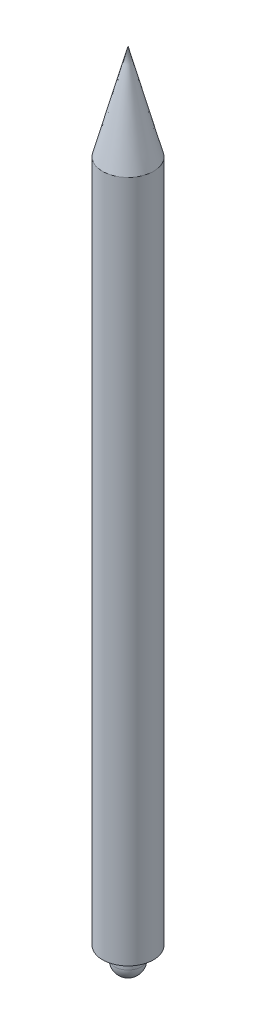
ISO-10303-21;
HEADER;
FILE_DESCRIPTION(('STEP AP214'),'2;1');
FILE_NAME('part.step','',(''),(''),'','','');
FILE_SCHEMA(('AUTOMOTIVE_DESIGN { 1 0 10303 214 1 1 1 1 }'));
ENDSEC;
DATA;
#1=APPLICATION_CONTEXT('core data for automotive mechanical design processes');
#2=APPLICATION_PROTOCOL_DEFINITION('international standard','automotive_design',2000,#1);
#3=PRODUCT_CONTEXT('',#1,'mechanical');
#4=PRODUCT('Part','Part','',(#3));
#5=PRODUCT_RELATED_PRODUCT_CATEGORY('part','',(#4));
#6=PRODUCT_DEFINITION_FORMATION('','',#4);
#7=PRODUCT_DEFINITION_CONTEXT('part definition',#1,'design');
#8=PRODUCT_DEFINITION('design','',#6,#7);
#9=PRODUCT_DEFINITION_SHAPE('','',#8);
#10=(LENGTH_UNIT() NAMED_UNIT(*) SI_UNIT(.MILLI.,.METRE.));
#11=(NAMED_UNIT(*) PLANE_ANGLE_UNIT() SI_UNIT($,.RADIAN.));
#12=(NAMED_UNIT(*) SI_UNIT($,.STERADIAN.) SOLID_ANGLE_UNIT());
#13=UNCERTAINTY_MEASURE_WITH_UNIT(LENGTH_MEASURE(1.E-05),#10,'distance_accuracy_value','');
#14=(GEOMETRIC_REPRESENTATION_CONTEXT(3) GLOBAL_UNCERTAINTY_ASSIGNED_CONTEXT((#13)) GLOBAL_UNIT_ASSIGNED_CONTEXT((#10,
#11,#12)) REPRESENTATION_CONTEXT('',''));
#15=CARTESIAN_POINT('',(0.,0.,0.));
#16=DIRECTION('',(0.,0.,1.));
#17=DIRECTION('',(1.,0.,0.));
#18=AXIS2_PLACEMENT_3D('',#15,#16,#17);
#19=CARTESIAN_POINT('',(0.,114.,0.));
#20=DIRECTION('',(0.,-1.,0.));
#21=DIRECTION('',(0.,0.,-1.));
#22=AXIS2_PLACEMENT_3D('',#19,#20,#21);
#23=CYLINDRICAL_SURFACE('',#22,4.25);
#24=CARTESIAN_POINT('',(0.,114.,0.));
#25=DIRECTION('',(0.,1.,0.));
#26=DIRECTION('',(0.,0.,1.));
#27=AXIS2_PLACEMENT_3D('',#24,#25,#26);
#28=CIRCLE('',#27,4.25);
#29=CARTESIAN_POINT('',(0.,114.,-4.25));
#30=VERTEX_POINT('',#29);
#31=EDGE_CURVE('E11',#30,#30,#28,.T.);
#32=CARTESIAN_POINT('',(0.,0.,0.));
#33=DIRECTION('',(0.,1.,0.));
#34=DIRECTION('',(0.,0.,1.));
#35=AXIS2_PLACEMENT_3D('',#32,#33,#34);
#36=CIRCLE('',#35,4.25);
#37=CARTESIAN_POINT('',(0.,0.,-4.25));
#38=VERTEX_POINT('',#37);
#39=EDGE_CURVE('E36',#38,#38,#36,.T.);
#40=CARTESIAN_POINT('',(0.,114.,-4.25));
#41=CARTESIAN_POINT('',(0.,112.8125,-4.25));
#42=CARTESIAN_POINT('',(0.,111.625,-4.25));
#43=CARTESIAN_POINT('',(0.,109.25,-4.25));
#44=CARTESIAN_POINT('',(0.,108.0625,-4.25));
#45=CARTESIAN_POINT('',(0.,105.6875,-4.25));
#46=CARTESIAN_POINT('',(0.,104.5,-4.25));
#47=CARTESIAN_POINT('',(0.,102.125,-4.25));
#48=CARTESIAN_POINT('',(0.,100.9375,-4.25));
#49=CARTESIAN_POINT('',(0.,98.5625,-4.25));
#50=CARTESIAN_POINT('',(0.,97.375,-4.25));
#51=CARTESIAN_POINT('',(0.,95.,-4.25));
#52=CARTESIAN_POINT('',(0.,93.8125,-4.25));
#53=CARTESIAN_POINT('',(0.,91.4375,-4.25));
#54=CARTESIAN_POINT('',(0.,90.25,-4.25));
#55=CARTESIAN_POINT('',(0.,87.875,-4.25));
#56=CARTESIAN_POINT('',(0.,86.6875,-4.25));
#57=CARTESIAN_POINT('',(0.,84.3125,-4.25));
#58=CARTESIAN_POINT('',(0.,83.125,-4.25));
#59=CARTESIAN_POINT('',(0.,80.75,-4.25));
#60=CARTESIAN_POINT('',(0.,79.5625,-4.25));
#61=CARTESIAN_POINT('',(0.,77.1875,-4.25));
#62=CARTESIAN_POINT('',(0.,76.,-4.25));
#63=CARTESIAN_POINT('',(0.,73.625,-4.25));
#64=CARTESIAN_POINT('',(0.,72.4375,-4.25));
#65=CARTESIAN_POINT('',(0.,70.0625,-4.25));
#66=CARTESIAN_POINT('',(0.,68.875,-4.25));
#67=CARTESIAN_POINT('',(0.,66.5,-4.25));
#68=CARTESIAN_POINT('',(0.,65.3125,-4.25));
#69=CARTESIAN_POINT('',(0.,62.9375,-4.25));
#70=CARTESIAN_POINT('',(0.,61.75,-4.25));
#71=CARTESIAN_POINT('',(0.,59.375,-4.25));
#72=CARTESIAN_POINT('',(0.,58.1875,-4.25));
#73=CARTESIAN_POINT('',(0.,55.8125,-4.25));
#74=CARTESIAN_POINT('',(0.,54.625,-4.25));
#75=CARTESIAN_POINT('',(0.,52.25,-4.25));
#76=CARTESIAN_POINT('',(0.,51.0625,-4.25));
#77=CARTESIAN_POINT('',(0.,48.6875,-4.25));
#78=CARTESIAN_POINT('',(0.,47.5,-4.25));
#79=CARTESIAN_POINT('',(0.,45.125,-4.25));
#80=CARTESIAN_POINT('',(0.,43.9375,-4.25));
#81=CARTESIAN_POINT('',(0.,41.5625,-4.25));
#82=CARTESIAN_POINT('',(0.,40.375,-4.25));
#83=CARTESIAN_POINT('',(0.,38.,-4.25));
#84=CARTESIAN_POINT('',(0.,36.8125,-4.25));
#85=CARTESIAN_POINT('',(0.,34.4375,-4.25));
#86=CARTESIAN_POINT('',(0.,33.25,-4.25));
#87=CARTESIAN_POINT('',(0.,30.875,-4.25));
#88=CARTESIAN_POINT('',(0.,29.6875,-4.25));
#89=CARTESIAN_POINT('',(0.,27.3125,-4.25));
#90=CARTESIAN_POINT('',(0.,26.125,-4.25));
#91=CARTESIAN_POINT('',(0.,23.75,-4.25));
#92=CARTESIAN_POINT('',(0.,22.5625,-4.25));
#93=CARTESIAN_POINT('',(0.,20.1875,-4.25));
#94=CARTESIAN_POINT('',(0.,19.,-4.25));
#95=CARTESIAN_POINT('',(0.,16.625,-4.25));
#96=CARTESIAN_POINT('',(0.,15.4375,-4.25));
#97=CARTESIAN_POINT('',(0.,13.0625,-4.25));
#98=CARTESIAN_POINT('',(0.,11.875,-4.25));
#99=CARTESIAN_POINT('',(0.,9.5,-4.25));
#100=CARTESIAN_POINT('',(0.,8.31250000000001,-4.25));
#101=CARTESIAN_POINT('',(0.,5.9375,-4.25));
#102=CARTESIAN_POINT('',(0.,4.75,-4.25));
#103=CARTESIAN_POINT('',(0.,2.375,-4.25));
#104=CARTESIAN_POINT('',(0.,1.1875,-4.25));
#105=CARTESIAN_POINT('',(0.,0.,-4.25));
#106=B_SPLINE_CURVE_WITH_KNOTS('',3,(#40,#41,#42,#43,#44,#45,#46,#47,#48,#49,#50,#51,#52,#53,
#54,#55,#56,#57,#58,#59,#60,#61,#62,#63,#64,#65,#66,#67,#68,#69,#70,#71,#72,#73,#74,#75,#76,#77,
#78,#79,#80,#81,#82,#83,#84,#85,#86,#87,#88,#89,#90,#91,#92,#93,#94,#95,#96,#97,#98,#99,#100,
#101,#102,#103,#104,#105),.UNSPECIFIED.,.F.,.F.,(4,2,2,2,2,2,2,2,2,2,2,2,2,2,2,2,2,2,2,2,2,2,2,
2,2,2,2,2,2,2,2,2,4),(0.,3.5625,7.12499999999999,10.6875,14.25,17.8125,21.375,24.9375,28.5,
32.0625,35.625,39.1875,42.75,46.3125,49.875,53.4375,57.,60.5625,64.125,67.6875,71.25,74.8125,
78.375,81.9375,85.5,89.0625,92.625,96.1875,99.75,103.3125,106.875,110.4375,114.),.UNSPECIFIED.);
#107=EDGE_CURVE('BSEAM33',#30,#38,#106,.T.);
#108=ORIENTED_EDGE('',*,*,#31,.F.);
#109=ORIENTED_EDGE('',*,*,#39,.T.);
#110=ORIENTED_EDGE('',*,*,#107,.T.);
#111=ORIENTED_EDGE('',*,*,#107,.F.);
#112=EDGE_LOOP('',(#108,#110,#109,#111));
#113=FACE_BOUND('',#112,.T.);
#114=ADVANCED_FACE('F33',(#113),#23,.T.);
#115=CARTESIAN_POINT('',(0.,0.,0.));
#116=DIRECTION('',(0.,1.,0.));
#117=DIRECTION('',(0.,0.,1.));
#118=AXIS2_PLACEMENT_3D('',#115,#116,#117);
#119=PLANE('',#118);
#120=CARTESIAN_POINT('',(0.,0.,0.));
#121=DIRECTION('',(0.,1.,0.));
#122=DIRECTION('',(-1.,0.,0.));
#123=AXIS2_PLACEMENT_3D('',#120,#121,#122);
#124=CIRCLE('',#123,2.25);
#125=CARTESIAN_POINT('',(-2.25,0.,0.));
#126=VERTEX_POINT('',#125);
#127=EDGE_CURVE('E57',#126,#126,#124,.T.);
#128=ORIENTED_EDGE('',*,*,#127,.T.);
#129=EDGE_LOOP('',(#128));
#130=FACE_BOUND('',#129,.T.);
#131=ORIENTED_EDGE('',*,*,#39,.F.);
#132=EDGE_LOOP('',(#131));
#133=FACE_BOUND('',#132,.T.);
#134=ADVANCED_FACE('F51',(#130,#133),#119,.F.);
#135=CARTESIAN_POINT('',(0.,-2.,0.));
#136=DIRECTION('',(0.,1.,0.));
#137=DIRECTION('',(-1.,0.,0.));
#138=AXIS2_PLACEMENT_3D('',#135,#136,#137);
#139=SPHERICAL_SURFACE('',#138,2.25);
#140=CARTESIAN_POINT('',(0.,-2.00000000000003,0.));
#141=DIRECTION('',(0.,1.,0.));
#142=DIRECTION('',(-1.,0.,0.));
#143=AXIS2_PLACEMENT_3D('',#140,#141,#142);
#144=CIRCLE('',#143,2.25);
#145=CARTESIAN_POINT('',(-2.25,-2.00000000000003,0.));
#146=VERTEX_POINT('',#145);
#147=EDGE_CURVE('E55',#146,#146,#144,.T.);
#148=ORIENTED_EDGE('',*,*,#147,.F.);
#149=EDGE_LOOP('',(#148));
#150=FACE_BOUND('',#149,.T.);
#151=ADVANCED_FACE('F67',(#150),#139,.T.);
#152=CARTESIAN_POINT('',(0.,0.,0.));
#153=DIRECTION('',(0.,1.,0.));
#154=DIRECTION('',(-1.,0.,0.));
#155=AXIS2_PLACEMENT_3D('',#152,#153,#154);
#156=CYLINDRICAL_SURFACE('',#155,2.25);
#157=ORIENTED_EDGE('',*,*,#127,.F.);
#158=EDGE_LOOP('',(#157));
#159=FACE_BOUND('',#158,.T.);
#160=ORIENTED_EDGE('',*,*,#147,.T.);
#161=EDGE_LOOP('',(#160));
#162=FACE_BOUND('',#161,.T.);
#163=ADVANCED_FACE('F45',(#159,#162),#156,.T.);
#164=CARTESIAN_POINT('',(0.,114.,0.));
#165=DIRECTION('',(0.,-1.,0.));
#166=DIRECTION('',(0.,0.,-1.));
#167=AXIS2_PLACEMENT_3D('',#164,#165,#166);
#168=CONICAL_SURFACE('',#167,4.25,0.259629629408258);
#169=CARTESIAN_POINT('',(0.,130.,0.));
#170=VERTEX_POINT('',#169);
#171=VERTEX_LOOP('',#170);
#172=FACE_BOUND('',#171,.T.);
#173=ORIENTED_EDGE('',*,*,#31,.T.);
#174=EDGE_LOOP('',(#173));
#175=FACE_BOUND('',#174,.T.);
#176=ADVANCED_FACE('F42',(#172,#175),#168,.T.);
#177=CLOSED_SHELL('',(#114,#134,#151,#163,#176));
#178=MANIFOLD_SOLID_BREP('B2',#177);
#179=ADVANCED_BREP_SHAPE_REPRESENTATION('',(#18,#178),#14);
#180=SHAPE_DEFINITION_REPRESENTATION(#9,#179);
ENDSEC;
END-ISO-10303-21;
